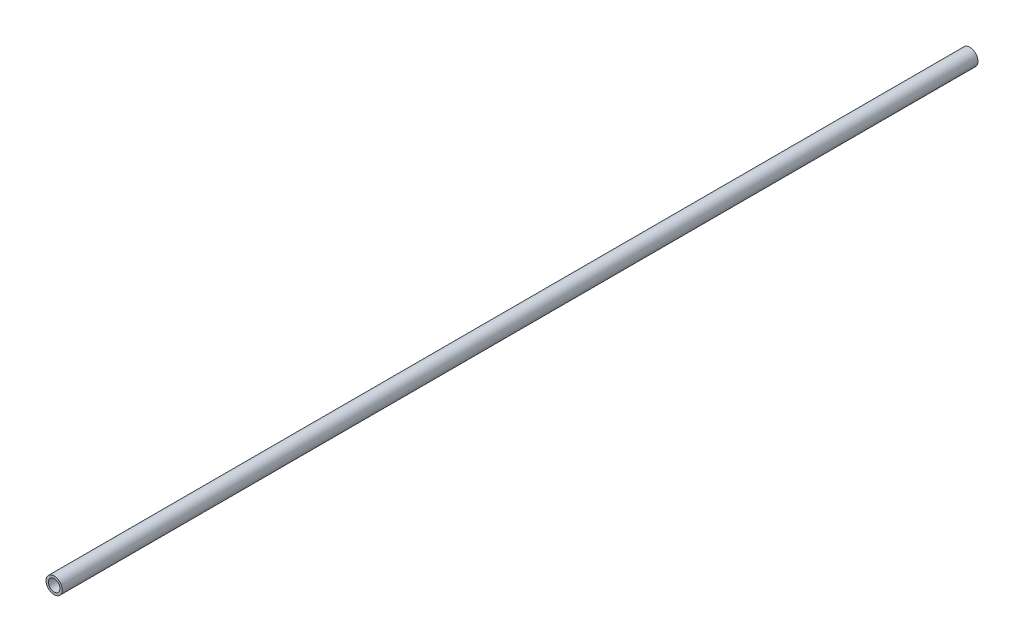
ISO-10303-21;
HEADER;
FILE_DESCRIPTION(('STEP AP214'),'2;1');
FILE_NAME('part.step','',(''),(''),'','','');
FILE_SCHEMA(('AUTOMOTIVE_DESIGN { 1 0 10303 214 1 1 1 1 }'));
ENDSEC;
DATA;
#1=APPLICATION_CONTEXT('core data for automotive mechanical design processes');
#2=APPLICATION_PROTOCOL_DEFINITION('international standard','automotive_design',2000,#1);
#3=PRODUCT_CONTEXT('',#1,'mechanical');
#4=PRODUCT('Part','Part','',(#3));
#5=PRODUCT_RELATED_PRODUCT_CATEGORY('part','',(#4));
#6=PRODUCT_DEFINITION_FORMATION('','',#4);
#7=PRODUCT_DEFINITION_CONTEXT('part definition',#1,'design');
#8=PRODUCT_DEFINITION('design','',#6,#7);
#9=PRODUCT_DEFINITION_SHAPE('','',#8);
#10=(LENGTH_UNIT() NAMED_UNIT(*) SI_UNIT(.MILLI.,.METRE.));
#11=(NAMED_UNIT(*) PLANE_ANGLE_UNIT() SI_UNIT($,.RADIAN.));
#12=(NAMED_UNIT(*) SI_UNIT($,.STERADIAN.) SOLID_ANGLE_UNIT());
#13=UNCERTAINTY_MEASURE_WITH_UNIT(LENGTH_MEASURE(1.E-05),#10,'distance_accuracy_value','');
#14=(GEOMETRIC_REPRESENTATION_CONTEXT(3) GLOBAL_UNCERTAINTY_ASSIGNED_CONTEXT((#13)) GLOBAL_UNIT_ASSIGNED_CONTEXT((#10,
#11,#12)) REPRESENTATION_CONTEXT('',''));
#15=CARTESIAN_POINT('',(0.,0.,0.));
#16=DIRECTION('',(0.,0.,1.));
#17=DIRECTION('',(1.,0.,0.));
#18=AXIS2_PLACEMENT_3D('',#15,#16,#17);
#19=CARTESIAN_POINT('',(0.,6.45576470611358,502.539));
#20=DIRECTION('',(0.,0.,1.));
#21=DIRECTION('',(1.,0.,0.));
#22=AXIS2_PLACEMENT_3D('',#19,#20,#21);
#23=PLANE('',#22);
#24=CARTESIAN_POINT('',(0.,6.45576470611358,502.539));
#25=DIRECTION('',(0.,0.,1.));
#26=DIRECTION('',(1.,0.,0.));
#27=AXIS2_PLACEMENT_3D('',#24,#25,#26);
#28=CIRCLE('',#27,4.4704);
#29=CARTESIAN_POINT('',(4.4704,6.45576470611358,502.539));
#30=VERTEX_POINT('',#29);
#31=EDGE_CURVE('E10',#30,#30,#28,.T.);
#32=ORIENTED_EDGE('',*,*,#31,.T.);
#33=EDGE_LOOP('',(#32));
#34=FACE_BOUND('',#33,.T.);
#35=CARTESIAN_POINT('',(0.,6.45576470611358,502.539));
#36=DIRECTION('',(0.,0.,1.));
#37=DIRECTION('',(1.,0.,0.));
#38=AXIS2_PLACEMENT_3D('',#35,#36,#37);
#39=CIRCLE('',#38,3.175);
#40=CARTESIAN_POINT('',(3.175,6.45576470611358,502.539));
#41=VERTEX_POINT('',#40);
#42=EDGE_CURVE('E42',#41,#41,#39,.T.);
#43=ORIENTED_EDGE('',*,*,#42,.F.);
#44=EDGE_LOOP('',(#43));
#45=FACE_BOUND('',#44,.T.);
#46=ADVANCED_FACE('F31',(#34,#45),#23,.T.);
#47=CARTESIAN_POINT('',(0.,6.45576470611358,0.));
#48=DIRECTION('',(0.,0.,1.));
#49=DIRECTION('',(1.,0.,0.));
#50=AXIS2_PLACEMENT_3D('',#47,#48,#49);
#51=PLANE('',#50);
#52=CARTESIAN_POINT('',(0.,6.45576470611358,0.));
#53=DIRECTION('',(0.,0.,1.));
#54=DIRECTION('',(1.,0.,0.));
#55=AXIS2_PLACEMENT_3D('',#52,#53,#54);
#56=CIRCLE('',#55,4.4704);
#57=CARTESIAN_POINT('',(4.4704,6.45576470611358,0.));
#58=VERTEX_POINT('',#57);
#59=EDGE_CURVE('E35',#58,#58,#56,.T.);
#60=ORIENTED_EDGE('',*,*,#59,.F.);
#61=EDGE_LOOP('',(#60));
#62=FACE_BOUND('',#61,.T.);
#63=CARTESIAN_POINT('',(0.,6.45576470611358,0.));
#64=DIRECTION('',(0.,0.,1.));
#65=DIRECTION('',(1.,0.,0.));
#66=AXIS2_PLACEMENT_3D('',#63,#64,#65);
#67=CIRCLE('',#66,3.175);
#68=CARTESIAN_POINT('',(3.175,6.45576470611358,0.));
#69=VERTEX_POINT('',#68);
#70=EDGE_CURVE('E44',#69,#69,#67,.T.);
#71=ORIENTED_EDGE('',*,*,#70,.T.);
#72=EDGE_LOOP('',(#71));
#73=FACE_BOUND('',#72,.T.);
#74=ADVANCED_FACE('F54',(#62,#73),#51,.F.);
#75=CARTESIAN_POINT('',(0.,6.45576470611358,502.539));
#76=DIRECTION('',(0.,0.,-1.));
#77=DIRECTION('',(-1.,0.,0.));
#78=AXIS2_PLACEMENT_3D('',#75,#76,#77);
#79=CYLINDRICAL_SURFACE('',#78,4.4704);
#80=ORIENTED_EDGE('',*,*,#31,.F.);
#81=EDGE_LOOP('',(#80));
#82=FACE_BOUND('',#81,.T.);
#83=ORIENTED_EDGE('',*,*,#59,.T.);
#84=EDGE_LOOP('',(#83));
#85=FACE_BOUND('',#84,.T.);
#86=ADVANCED_FACE('F33',(#82,#85),#79,.T.);
#87=CARTESIAN_POINT('',(0.,6.45576470611358,502.539));
#88=DIRECTION('',(0.,0.,-1.));
#89=DIRECTION('',(-1.,0.,0.));
#90=AXIS2_PLACEMENT_3D('',#87,#88,#89);
#91=CYLINDRICAL_SURFACE('',#90,3.175);
#92=ORIENTED_EDGE('',*,*,#42,.T.);
#93=EDGE_LOOP('',(#92));
#94=FACE_BOUND('',#93,.T.);
#95=ORIENTED_EDGE('',*,*,#70,.F.);
#96=EDGE_LOOP('',(#95));
#97=FACE_BOUND('',#96,.T.);
#98=ADVANCED_FACE('F50',(#94,#97),#91,.F.);
#99=CLOSED_SHELL('',(#46,#74,#86,#98));
#100=MANIFOLD_SOLID_BREP('B2',#99);
#101=ADVANCED_BREP_SHAPE_REPRESENTATION('',(#18,#100),#14);
#102=SHAPE_DEFINITION_REPRESENTATION(#9,#101);
ENDSEC;
END-ISO-10303-21;
